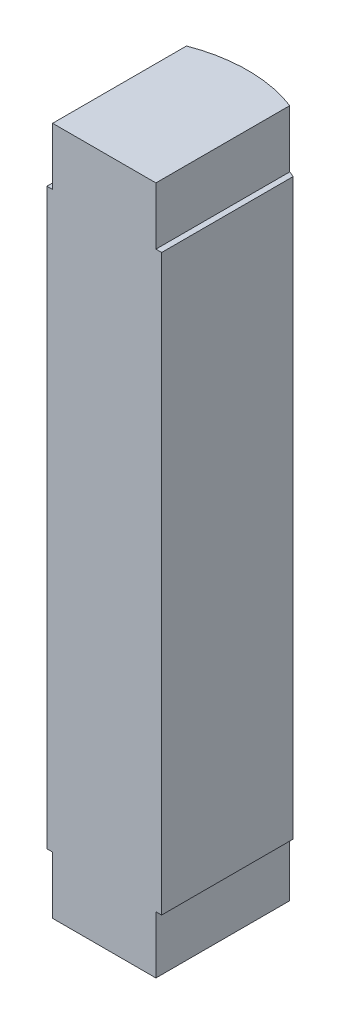
ISO-10303-21;
HEADER;
FILE_DESCRIPTION(('STEP AP214'),'2;1');
FILE_NAME('part.step','',(''),(''),'','','');
FILE_SCHEMA(('AUTOMOTIVE_DESIGN { 1 0 10303 214 1 1 1 1 }'));
ENDSEC;
DATA;
#1=APPLICATION_CONTEXT('core data for automotive mechanical design processes');
#2=APPLICATION_PROTOCOL_DEFINITION('international standard','automotive_design',2000,#1);
#3=PRODUCT_CONTEXT('',#1,'mechanical');
#4=PRODUCT('Part','Part','',(#3));
#5=PRODUCT_RELATED_PRODUCT_CATEGORY('part','',(#4));
#6=PRODUCT_DEFINITION_FORMATION('','',#4);
#7=PRODUCT_DEFINITION_CONTEXT('part definition',#1,'design');
#8=PRODUCT_DEFINITION('design','',#6,#7);
#9=PRODUCT_DEFINITION_SHAPE('','',#8);
#10=(LENGTH_UNIT() NAMED_UNIT(*) SI_UNIT(.MILLI.,.METRE.));
#11=(NAMED_UNIT(*) PLANE_ANGLE_UNIT() SI_UNIT($,.RADIAN.));
#12=(NAMED_UNIT(*) SI_UNIT($,.STERADIAN.) SOLID_ANGLE_UNIT());
#13=UNCERTAINTY_MEASURE_WITH_UNIT(LENGTH_MEASURE(1.E-05),#10,'distance_accuracy_value','');
#14=(GEOMETRIC_REPRESENTATION_CONTEXT(3) GLOBAL_UNCERTAINTY_ASSIGNED_CONTEXT((#13)) GLOBAL_UNIT_ASSIGNED_CONTEXT((#10,
#11,#12)) REPRESENTATION_CONTEXT('',''));
#15=CARTESIAN_POINT('',(0.,0.,0.));
#16=DIRECTION('',(0.,0.,1.));
#17=DIRECTION('',(1.,0.,0.));
#18=AXIS2_PLACEMENT_3D('',#15,#16,#17);
#19=CARTESIAN_POINT('',(-5.,60.,-11.4564392373896));
#20=DIRECTION('',(1.,0.,0.));
#21=DIRECTION('',(0.,0.,-1.));
#22=AXIS2_PLACEMENT_3D('',#19,#20,#21);
#23=PLANE('',#22);
#24=DIRECTION('',(0.,-1.,0.));
#25=VECTOR('',#24,1.);
#26=CARTESIAN_POINT('',(-5.,60.,0.));
#27=LINE('',#26,#25);
#28=CARTESIAN_POINT('',(-5.,55.,0.));
#29=VERTEX_POINT('',#28);
#30=CARTESIAN_POINT('',(-5.,5.,0.));
#31=VERTEX_POINT('',#30);
#32=EDGE_CURVE('E139',#29,#31,#27,.T.);
#33=ORIENTED_EDGE('',*,*,#32,.F.);
#34=DIRECTION('',(0.,0.,1.));
#35=VECTOR('',#34,1.);
#36=CARTESIAN_POINT('',(-5.,55.,-20.));
#37=LINE('',#36,#35);
#38=CARTESIAN_POINT('',(-5.,55.,-11.4564392373896));
#39=VERTEX_POINT('',#38);
#40=EDGE_CURVE('E125',#39,#29,#37,.T.);
#41=ORIENTED_EDGE('',*,*,#40,.F.);
#42=DIRECTION('',(0.,-1.,0.));
#43=VECTOR('',#42,1.);
#44=CARTESIAN_POINT('',(-5.,60.,-11.4564392373896));
#45=LINE('',#44,#43);
#46=CARTESIAN_POINT('',(-5.,5.,-11.4564392373896));
#47=VERTEX_POINT('',#46);
#48=EDGE_CURVE('E179',#39,#47,#45,.T.);
#49=ORIENTED_EDGE('',*,*,#48,.T.);
#50=DIRECTION('',(0.,0.,1.));
#51=VECTOR('',#50,1.);
#52=CARTESIAN_POINT('',(-5.,5.,-20.));
#53=LINE('',#52,#51);
#54=EDGE_CURVE('E144',#47,#31,#53,.T.);
#55=ORIENTED_EDGE('',*,*,#54,.T.);
#56=EDGE_LOOP('',(#33,#41,#49,#55));
#57=FACE_BOUND('',#56,.T.);
#58=ADVANCED_FACE('F35',(#57),#23,.F.);
#59=CARTESIAN_POINT('',(-5.,60.,0.));
#60=DIRECTION('',(0.,0.,-1.));
#61=DIRECTION('',(-1.,0.,0.));
#62=AXIS2_PLACEMENT_3D('',#59,#60,#61);
#63=PLANE('',#62);
#64=DIRECTION('',(1.,0.,0.));
#65=VECTOR('',#64,1.);
#66=CARTESIAN_POINT('',(-5.,60.,0.));
#67=LINE('',#66,#65);
#68=CARTESIAN_POINT('',(-4.5,60.,0.));
#69=VERTEX_POINT('',#68);
#70=CARTESIAN_POINT('',(4.5,60.,0.));
#71=VERTEX_POINT('',#70);
#72=EDGE_CURVE('E180',#69,#71,#67,.T.);
#73=ORIENTED_EDGE('',*,*,#72,.F.);
#74=DIRECTION('',(0.,1.,0.));
#75=VECTOR('',#74,1.);
#76=CARTESIAN_POINT('',(-4.5,60.,0.));
#77=LINE('',#76,#75);
#78=CARTESIAN_POINT('',(-4.5,55.,0.));
#79=VERTEX_POINT('',#78);
#80=EDGE_CURVE('E49',#79,#69,#77,.T.);
#81=ORIENTED_EDGE('',*,*,#80,.F.);
#82=DIRECTION('',(1.,0.,0.));
#83=VECTOR('',#82,1.);
#84=CARTESIAN_POINT('',(-5.,55.,0.));
#85=LINE('',#84,#83);
#86=EDGE_CURVE('E129',#29,#79,#85,.T.);
#87=ORIENTED_EDGE('',*,*,#86,.F.);
#88=ORIENTED_EDGE('',*,*,#32,.T.);
#89=DIRECTION('',(-1.,0.,0.));
#90=VECTOR('',#89,1.);
#91=CARTESIAN_POINT('',(-5.,5.,0.));
#92=LINE('',#91,#90);
#93=CARTESIAN_POINT('',(-4.5,5.,0.));
#94=VERTEX_POINT('',#93);
#95=EDGE_CURVE('E218',#94,#31,#92,.T.);
#96=ORIENTED_EDGE('',*,*,#95,.F.);
#97=DIRECTION('',(0.,1.,0.));
#98=VECTOR('',#97,1.);
#99=CARTESIAN_POINT('',(-4.5,0.,0.));
#100=LINE('',#99,#98);
#101=CARTESIAN_POINT('',(-4.5,0.,0.));
#102=VERTEX_POINT('',#101);
#103=EDGE_CURVE('E215',#102,#94,#100,.T.);
#104=ORIENTED_EDGE('',*,*,#103,.F.);
#105=DIRECTION('',(1.,0.,0.));
#106=VECTOR('',#105,1.);
#107=CARTESIAN_POINT('',(-5.,0.,0.));
#108=LINE('',#107,#106);
#109=CARTESIAN_POINT('',(4.5,0.,0.));
#110=VERTEX_POINT('',#109);
#111=EDGE_CURVE('E187',#102,#110,#108,.T.);
#112=ORIENTED_EDGE('',*,*,#111,.T.);
#113=DIRECTION('',(0.,-1.,0.));
#114=VECTOR('',#113,1.);
#115=CARTESIAN_POINT('',(4.5,0.,0.));
#116=LINE('',#115,#114);
#117=CARTESIAN_POINT('',(4.5,5.,0.));
#118=VERTEX_POINT('',#117);
#119=EDGE_CURVE('E207',#118,#110,#116,.T.);
#120=ORIENTED_EDGE('',*,*,#119,.F.);
#121=DIRECTION('',(-1.,0.,0.));
#122=VECTOR('',#121,1.);
#123=CARTESIAN_POINT('',(5.,5.,0.));
#124=LINE('',#123,#122);
#125=CARTESIAN_POINT('',(5.,5.,0.));
#126=VERTEX_POINT('',#125);
#127=EDGE_CURVE('E211',#126,#118,#124,.T.);
#128=ORIENTED_EDGE('',*,*,#127,.F.);
#129=DIRECTION('',(0.,-1.,0.));
#130=VECTOR('',#129,1.);
#131=CARTESIAN_POINT('',(5.,60.,0.));
#132=LINE('',#131,#130);
#133=CARTESIAN_POINT('',(5.,55.,0.));
#134=VERTEX_POINT('',#133);
#135=EDGE_CURVE('E146',#134,#126,#132,.T.);
#136=ORIENTED_EDGE('',*,*,#135,.F.);
#137=DIRECTION('',(1.,0.,0.));
#138=VECTOR('',#137,1.);
#139=CARTESIAN_POINT('',(5.,55.,0.));
#140=LINE('',#139,#138);
#141=CARTESIAN_POINT('',(4.5,55.,0.));
#142=VERTEX_POINT('',#141);
#143=EDGE_CURVE('E333',#142,#134,#140,.T.);
#144=ORIENTED_EDGE('',*,*,#143,.F.);
#145=DIRECTION('',(0.,-1.,0.));
#146=VECTOR('',#145,1.);
#147=CARTESIAN_POINT('',(4.5,60.,0.));
#148=LINE('',#147,#146);
#149=EDGE_CURVE('E176',#71,#142,#148,.T.);
#150=ORIENTED_EDGE('',*,*,#149,.F.);
#151=EDGE_LOOP('',(#73,#81,#87,#88,#96,#104,#112,#120,#128,#136,#144,#150));
#152=FACE_BOUND('',#151,.T.);
#153=ADVANCED_FACE('F137',(#152),#63,.F.);
#154=CARTESIAN_POINT('',(5.,60.,0.));
#155=DIRECTION('',(-1.,0.,0.));
#156=DIRECTION('',(0.,0.,1.));
#157=AXIS2_PLACEMENT_3D('',#154,#155,#156);
#158=PLANE('',#157);
#159=DIRECTION('',(0.,-1.,0.));
#160=VECTOR('',#159,1.);
#161=CARTESIAN_POINT('',(5.,60.,-11.4564392373896));
#162=LINE('',#161,#160);
#163=CARTESIAN_POINT('',(5.,55.,-11.4564392373896));
#164=VERTEX_POINT('',#163);
#165=CARTESIAN_POINT('',(5.,5.,-11.4564392373896));
#166=VERTEX_POINT('',#165);
#167=EDGE_CURVE('E151',#164,#166,#162,.T.);
#168=ORIENTED_EDGE('',*,*,#167,.F.);
#169=DIRECTION('',(0.,0.,1.));
#170=VECTOR('',#169,1.);
#171=CARTESIAN_POINT('',(5.,55.,-20.));
#172=LINE('',#171,#170);
#173=EDGE_CURVE('E338',#164,#134,#172,.T.);
#174=ORIENTED_EDGE('',*,*,#173,.T.);
#175=ORIENTED_EDGE('',*,*,#135,.T.);
#176=DIRECTION('',(0.,0.,1.));
#177=VECTOR('',#176,1.);
#178=CARTESIAN_POINT('',(5.,5.,-20.));
#179=LINE('',#178,#177);
#180=EDGE_CURVE('E202',#166,#126,#179,.T.);
#181=ORIENTED_EDGE('',*,*,#180,.F.);
#182=EDGE_LOOP('',(#168,#174,#175,#181));
#183=FACE_BOUND('',#182,.T.);
#184=ADVANCED_FACE('F205',(#183),#158,.F.);
#185=CARTESIAN_POINT('',(0.,60.,0.));
#186=DIRECTION('',(0.,-1.,0.));
#187=DIRECTION('',(0.,0.,-1.));
#188=AXIS2_PLACEMENT_3D('',#185,#186,#187);
#189=CYLINDRICAL_SURFACE('',#188,12.5);
#190=CARTESIAN_POINT('',(0.,55.,0.));
#191=DIRECTION('',(0.,-1.,0.));
#192=DIRECTION('',(0.,0.,-1.));
#193=AXIS2_PLACEMENT_3D('',#190,#191,#192);
#194=CIRCLE('',#193,12.5);
#195=CARTESIAN_POINT('',(-4.5,55.,-11.6619037896906));
#196=VERTEX_POINT('',#195);
#197=EDGE_CURVE('E11',#39,#196,#194,.T.);
#198=ORIENTED_EDGE('',*,*,#197,.T.);
#199=DIRECTION('',(0.,-1.,0.));
#200=VECTOR('',#199,1.);
#201=CARTESIAN_POINT('',(-4.5,60.,-11.6619037896906));
#202=LINE('',#201,#200);
#203=CARTESIAN_POINT('',(-4.5,60.,-11.6619037896906));
#204=VERTEX_POINT('',#203);
#205=EDGE_CURVE('E169',#196,#204,#202,.F.);
#206=ORIENTED_EDGE('',*,*,#205,.T.);
#207=CARTESIAN_POINT('',(0.,60.,0.));
#208=DIRECTION('',(0.,1.,0.));
#209=DIRECTION('',(0.,0.,1.));
#210=AXIS2_PLACEMENT_3D('',#207,#208,#209);
#211=CIRCLE('',#210,12.5);
#212=CARTESIAN_POINT('',(4.5,60.,-11.6619037896906));
#213=VERTEX_POINT('',#212);
#214=EDGE_CURVE('E175',#213,#204,#211,.T.);
#215=ORIENTED_EDGE('',*,*,#214,.F.);
#216=DIRECTION('',(0.,-1.,0.));
#217=VECTOR('',#216,1.);
#218=CARTESIAN_POINT('',(4.5,60.,-11.6619037896906));
#219=LINE('',#218,#217);
#220=CARTESIAN_POINT('',(4.5,55.,-11.6619037896906));
#221=VERTEX_POINT('',#220);
#222=EDGE_CURVE('E57',#213,#221,#219,.T.);
#223=ORIENTED_EDGE('',*,*,#222,.T.);
#224=CARTESIAN_POINT('',(0.,55.,0.));
#225=DIRECTION('',(0.,-1.,0.));
#226=DIRECTION('',(0.,0.,-1.));
#227=AXIS2_PLACEMENT_3D('',#224,#225,#226);
#228=CIRCLE('',#227,12.5);
#229=EDGE_CURVE('E165',#221,#164,#228,.T.);
#230=ORIENTED_EDGE('',*,*,#229,.T.);
#231=ORIENTED_EDGE('',*,*,#167,.T.);
#232=CARTESIAN_POINT('',(0.,5.,0.));
#233=DIRECTION('',(0.,1.,0.));
#234=DIRECTION('',(0.,0.,1.));
#235=AXIS2_PLACEMENT_3D('',#232,#233,#234);
#236=CIRCLE('',#235,12.5);
#237=CARTESIAN_POINT('',(4.5,5.,-11.6619037896906));
#238=VERTEX_POINT('',#237);
#239=EDGE_CURVE('E160',#166,#238,#236,.T.);
#240=ORIENTED_EDGE('',*,*,#239,.T.);
#241=DIRECTION('',(0.,-1.,0.));
#242=VECTOR('',#241,1.);
#243=CARTESIAN_POINT('',(4.5,60.,-11.6619037896906));
#244=LINE('',#243,#242);
#245=CARTESIAN_POINT('',(4.5,0.,-11.6619037896906));
#246=VERTEX_POINT('',#245);
#247=EDGE_CURVE('E209',#238,#246,#244,.T.);
#248=ORIENTED_EDGE('',*,*,#247,.T.);
#249=CARTESIAN_POINT('',(0.,0.,0.));
#250=DIRECTION('',(0.,1.,0.));
#251=DIRECTION('',(0.,0.,1.));
#252=AXIS2_PLACEMENT_3D('',#249,#250,#251);
#253=CIRCLE('',#252,12.5);
#254=CARTESIAN_POINT('',(-4.5,0.,-11.6619037896906));
#255=VERTEX_POINT('',#254);
#256=EDGE_CURVE('E183',#246,#255,#253,.T.);
#257=ORIENTED_EDGE('',*,*,#256,.T.);
#258=DIRECTION('',(0.,-1.,0.));
#259=VECTOR('',#258,1.);
#260=CARTESIAN_POINT('',(-4.5,60.,-11.6619037896906));
#261=LINE('',#260,#259);
#262=CARTESIAN_POINT('',(-4.5,5.,-11.6619037896906));
#263=VERTEX_POINT('',#262);
#264=EDGE_CURVE('E190',#255,#263,#261,.F.);
#265=ORIENTED_EDGE('',*,*,#264,.T.);
#266=CARTESIAN_POINT('',(0.,5.,0.));
#267=DIRECTION('',(0.,1.,0.));
#268=DIRECTION('',(0.,0.,1.));
#269=AXIS2_PLACEMENT_3D('',#266,#267,#268);
#270=CIRCLE('',#269,12.5);
#271=EDGE_CURVE('E149',#263,#47,#270,.T.);
#272=ORIENTED_EDGE('',*,*,#271,.T.);
#273=ORIENTED_EDGE('',*,*,#48,.F.);
#274=EDGE_LOOP('',(#198,#206,#215,#223,#230,#231,#240,#248,#257,#265,#272,#273));
#275=FACE_BOUND('',#274,.T.);
#276=ADVANCED_FACE('F174',(#275),#189,.T.);
#277=CARTESIAN_POINT('',(0.,60.,0.));
#278=DIRECTION('',(0.,1.,0.));
#279=DIRECTION('',(0.,0.,1.));
#280=AXIS2_PLACEMENT_3D('',#277,#278,#279);
#281=PLANE('',#280);
#282=DIRECTION('',(0.,0.,-1.));
#283=VECTOR('',#282,1.);
#284=CARTESIAN_POINT('',(-4.5,60.,0.));
#285=LINE('',#284,#283);
#286=EDGE_CURVE('E42',#69,#204,#285,.T.);
#287=ORIENTED_EDGE('',*,*,#286,.F.);
#288=ORIENTED_EDGE('',*,*,#72,.T.);
#289=DIRECTION('',(0.,0.,1.));
#290=VECTOR('',#289,1.);
#291=CARTESIAN_POINT('',(4.5,60.,0.));
#292=LINE('',#291,#290);
#293=EDGE_CURVE('E163',#213,#71,#292,.T.);
#294=ORIENTED_EDGE('',*,*,#293,.F.);
#295=ORIENTED_EDGE('',*,*,#214,.T.);
#296=EDGE_LOOP('',(#287,#288,#294,#295));
#297=FACE_BOUND('',#296,.T.);
#298=ADVANCED_FACE('F178',(#297),#281,.T.);
#299=CARTESIAN_POINT('',(0.,0.,0.));
#300=DIRECTION('',(0.,1.,0.));
#301=DIRECTION('',(0.,0.,1.));
#302=AXIS2_PLACEMENT_3D('',#299,#300,#301);
#303=PLANE('',#302);
#304=ORIENTED_EDGE('',*,*,#256,.F.);
#305=DIRECTION('',(0.,0.,1.));
#306=VECTOR('',#305,1.);
#307=CARTESIAN_POINT('',(4.5,0.,0.));
#308=LINE('',#307,#306);
#309=EDGE_CURVE('E157',#246,#110,#308,.T.);
#310=ORIENTED_EDGE('',*,*,#309,.T.);
#311=ORIENTED_EDGE('',*,*,#111,.F.);
#312=DIRECTION('',(0.,0.,-1.));
#313=VECTOR('',#312,1.);
#314=CARTESIAN_POINT('',(-4.5,0.,0.));
#315=LINE('',#314,#313);
#316=EDGE_CURVE('E145',#102,#255,#315,.T.);
#317=ORIENTED_EDGE('',*,*,#316,.T.);
#318=EDGE_LOOP('',(#304,#310,#311,#317));
#319=FACE_BOUND('',#318,.T.);
#320=ADVANCED_FACE('F231',(#319),#303,.F.);
#321=CARTESIAN_POINT('',(-5.,5.,-20.));
#322=DIRECTION('',(0.,1.,0.));
#323=DIRECTION('',(0.,0.,1.));
#324=AXIS2_PLACEMENT_3D('',#321,#322,#323);
#325=PLANE('',#324);
#326=DIRECTION('',(0.,0.,1.));
#327=VECTOR('',#326,1.);
#328=CARTESIAN_POINT('',(-4.5,5.,-20.));
#329=LINE('',#328,#327);
#330=EDGE_CURVE('E220',#263,#94,#329,.T.);
#331=ORIENTED_EDGE('',*,*,#330,.T.);
#332=ORIENTED_EDGE('',*,*,#95,.T.);
#333=ORIENTED_EDGE('',*,*,#54,.F.);
#334=ORIENTED_EDGE('',*,*,#271,.F.);
#335=EDGE_LOOP('',(#331,#332,#333,#334));
#336=FACE_BOUND('',#335,.T.);
#337=ADVANCED_FACE('F234',(#336),#325,.F.);
#338=CARTESIAN_POINT('',(-4.5,0.,-20.));
#339=DIRECTION('',(1.,0.,0.));
#340=DIRECTION('',(0.,0.,-1.));
#341=AXIS2_PLACEMENT_3D('',#338,#339,#340);
#342=PLANE('',#341);
#343=ORIENTED_EDGE('',*,*,#316,.F.);
#344=ORIENTED_EDGE('',*,*,#103,.T.);
#345=ORIENTED_EDGE('',*,*,#330,.F.);
#346=ORIENTED_EDGE('',*,*,#264,.F.);
#347=EDGE_LOOP('',(#343,#344,#345,#346));
#348=FACE_BOUND('',#347,.T.);
#349=ADVANCED_FACE('F227',(#348),#342,.F.);
#350=CARTESIAN_POINT('',(5.,5.,-20.));
#351=DIRECTION('',(0.,1.,0.));
#352=DIRECTION('',(0.,0.,1.));
#353=AXIS2_PLACEMENT_3D('',#350,#351,#352);
#354=PLANE('',#353);
#355=ORIENTED_EDGE('',*,*,#180,.T.);
#356=ORIENTED_EDGE('',*,*,#127,.T.);
#357=DIRECTION('',(0.,0.,1.));
#358=VECTOR('',#357,1.);
#359=CARTESIAN_POINT('',(4.5,5.,-20.));
#360=LINE('',#359,#358);
#361=EDGE_CURVE('E204',#238,#118,#360,.T.);
#362=ORIENTED_EDGE('',*,*,#361,.F.);
#363=ORIENTED_EDGE('',*,*,#239,.F.);
#364=EDGE_LOOP('',(#355,#356,#362,#363));
#365=FACE_BOUND('',#364,.T.);
#366=ADVANCED_FACE('F200',(#365),#354,.F.);
#367=CARTESIAN_POINT('',(4.5,0.,-20.));
#368=DIRECTION('',(-1.,0.,0.));
#369=DIRECTION('',(0.,0.,1.));
#370=AXIS2_PLACEMENT_3D('',#367,#368,#369);
#371=PLANE('',#370);
#372=ORIENTED_EDGE('',*,*,#361,.T.);
#373=ORIENTED_EDGE('',*,*,#119,.T.);
#374=ORIENTED_EDGE('',*,*,#309,.F.);
#375=ORIENTED_EDGE('',*,*,#247,.F.);
#376=EDGE_LOOP('',(#372,#373,#374,#375));
#377=FACE_BOUND('',#376,.T.);
#378=ADVANCED_FACE('F283',(#377),#371,.F.);
#379=CARTESIAN_POINT('',(5.,55.,-20.));
#380=DIRECTION('',(0.,-1.,0.));
#381=DIRECTION('',(0.,0.,-1.));
#382=AXIS2_PLACEMENT_3D('',#379,#380,#381);
#383=PLANE('',#382);
#384=DIRECTION('',(0.,0.,1.));
#385=VECTOR('',#384,1.);
#386=CARTESIAN_POINT('',(4.5,55.,-20.));
#387=LINE('',#386,#385);
#388=EDGE_CURVE('E335',#221,#142,#387,.T.);
#389=ORIENTED_EDGE('',*,*,#388,.T.);
#390=ORIENTED_EDGE('',*,*,#143,.T.);
#391=ORIENTED_EDGE('',*,*,#173,.F.);
#392=ORIENTED_EDGE('',*,*,#229,.F.);
#393=EDGE_LOOP('',(#389,#390,#391,#392));
#394=FACE_BOUND('',#393,.T.);
#395=ADVANCED_FACE('F291',(#394),#383,.F.);
#396=CARTESIAN_POINT('',(4.5,60.,-20.));
#397=DIRECTION('',(-1.,0.,0.));
#398=DIRECTION('',(0.,0.,1.));
#399=AXIS2_PLACEMENT_3D('',#396,#397,#398);
#400=PLANE('',#399);
#401=ORIENTED_EDGE('',*,*,#293,.T.);
#402=ORIENTED_EDGE('',*,*,#149,.T.);
#403=ORIENTED_EDGE('',*,*,#388,.F.);
#404=ORIENTED_EDGE('',*,*,#222,.F.);
#405=EDGE_LOOP('',(#401,#402,#403,#404));
#406=FACE_BOUND('',#405,.T.);
#407=ADVANCED_FACE('F301',(#406),#400,.F.);
#408=CARTESIAN_POINT('',(-5.,55.,-20.));
#409=DIRECTION('',(0.,-1.,0.));
#410=DIRECTION('',(0.,0.,-1.));
#411=AXIS2_PLACEMENT_3D('',#408,#409,#410);
#412=PLANE('',#411);
#413=ORIENTED_EDGE('',*,*,#40,.T.);
#414=ORIENTED_EDGE('',*,*,#86,.T.);
#415=DIRECTION('',(0.,0.,1.));
#416=VECTOR('',#415,1.);
#417=CARTESIAN_POINT('',(-4.5,55.,-20.));
#418=LINE('',#417,#416);
#419=EDGE_CURVE('E133',#196,#79,#418,.T.);
#420=ORIENTED_EDGE('',*,*,#419,.F.);
#421=ORIENTED_EDGE('',*,*,#197,.F.);
#422=EDGE_LOOP('',(#413,#414,#420,#421));
#423=FACE_BOUND('',#422,.T.);
#424=ADVANCED_FACE('F127',(#423),#412,.F.);
#425=CARTESIAN_POINT('',(-4.5,60.,-20.));
#426=DIRECTION('',(1.,0.,0.));
#427=DIRECTION('',(0.,0.,-1.));
#428=AXIS2_PLACEMENT_3D('',#425,#426,#427);
#429=PLANE('',#428);
#430=ORIENTED_EDGE('',*,*,#419,.T.);
#431=ORIENTED_EDGE('',*,*,#80,.T.);
#432=ORIENTED_EDGE('',*,*,#286,.T.);
#433=ORIENTED_EDGE('',*,*,#205,.F.);
#434=EDGE_LOOP('',(#430,#431,#432,#433));
#435=FACE_BOUND('',#434,.T.);
#436=ADVANCED_FACE('F168',(#435),#429,.F.);
#437=CLOSED_SHELL('',(#58,#153,#184,#276,#298,#320,#337,#349,#366,#378,#395,#407,#424,#436));
#438=MANIFOLD_SOLID_BREP('B2',#437);
#439=ADVANCED_BREP_SHAPE_REPRESENTATION('',(#18,#438),#14);
#440=SHAPE_DEFINITION_REPRESENTATION(#9,#439);
ENDSEC;
END-ISO-10303-21;
